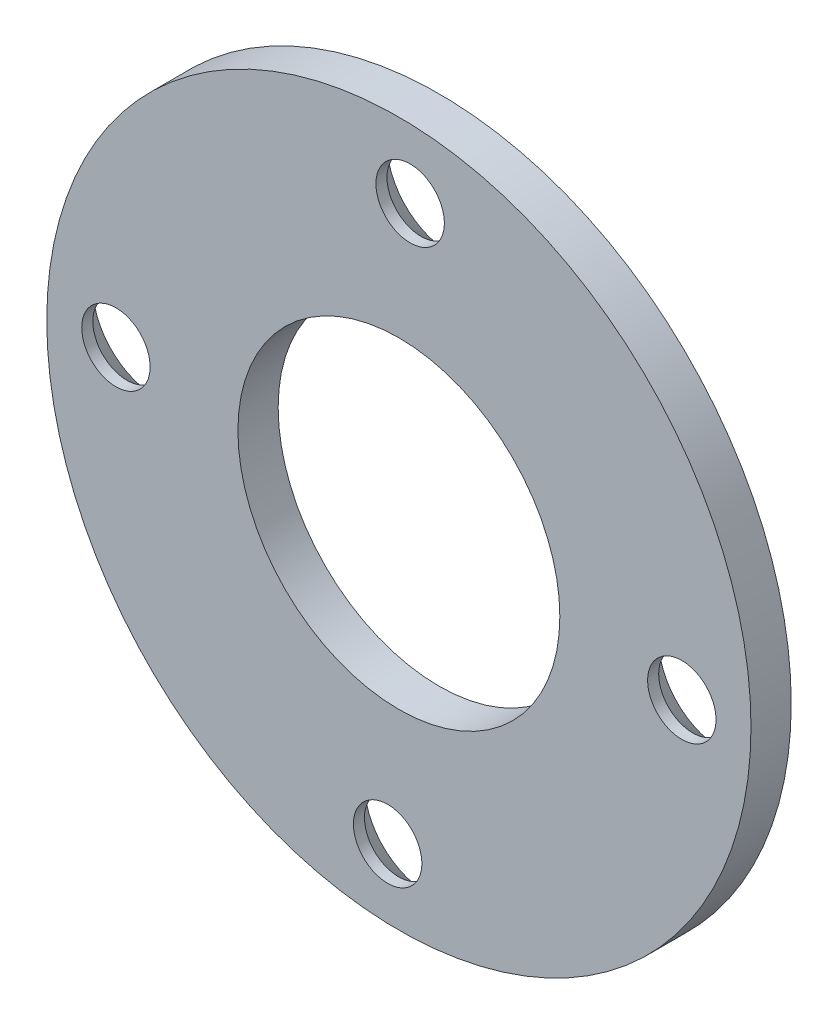
ISO-10303-21;
HEADER;
FILE_DESCRIPTION(('STEP AP214'),'2;1');
FILE_NAME('part.step','',(''),(''),'','','');
FILE_SCHEMA(('AUTOMOTIVE_DESIGN { 1 0 10303 214 1 1 1 1 }'));
ENDSEC;
DATA;
#1=APPLICATION_CONTEXT('core data for automotive mechanical design processes');
#2=APPLICATION_PROTOCOL_DEFINITION('international standard','automotive_design',2000,#1);
#3=PRODUCT_CONTEXT('',#1,'mechanical');
#4=PRODUCT('Part','Part','',(#3));
#5=PRODUCT_RELATED_PRODUCT_CATEGORY('part','',(#4));
#6=PRODUCT_DEFINITION_FORMATION('','',#4);
#7=PRODUCT_DEFINITION_CONTEXT('part definition',#1,'design');
#8=PRODUCT_DEFINITION('design','',#6,#7);
#9=PRODUCT_DEFINITION_SHAPE('','',#8);
#10=(LENGTH_UNIT() NAMED_UNIT(*) SI_UNIT(.MILLI.,.METRE.));
#11=(NAMED_UNIT(*) PLANE_ANGLE_UNIT() SI_UNIT($,.RADIAN.));
#12=(NAMED_UNIT(*) SI_UNIT($,.STERADIAN.) SOLID_ANGLE_UNIT());
#13=UNCERTAINTY_MEASURE_WITH_UNIT(LENGTH_MEASURE(1.E-05),#10,'distance_accuracy_value','');
#14=(GEOMETRIC_REPRESENTATION_CONTEXT(3) GLOBAL_UNCERTAINTY_ASSIGNED_CONTEXT((#13)) GLOBAL_UNIT_ASSIGNED_CONTEXT((#10,
#11,#12)) REPRESENTATION_CONTEXT('',''));
#15=CARTESIAN_POINT('',(0.,0.,0.));
#16=DIRECTION('',(0.,0.,1.));
#17=DIRECTION('',(1.,0.,0.));
#18=AXIS2_PLACEMENT_3D('',#15,#16,#17);
#19=CARTESIAN_POINT('',(0.,0.,2.));
#20=DIRECTION('',(0.,0.,1.));
#21=DIRECTION('',(1.,0.,0.));
#22=AXIS2_PLACEMENT_3D('',#19,#20,#21);
#23=PLANE('',#22);
#24=CARTESIAN_POINT('',(0.559155653984772,14.0619777082516,2.));
#25=DIRECTION('',(0.,0.,-1.));
#26=DIRECTION('',(-1.,0.,0.));
#27=AXIS2_PLACEMENT_3D('',#24,#25,#26);
#28=CIRCLE('',#27,1.7);
#29=CARTESIAN_POINT('',(-1.14084434601523,14.0619777082516,2.));
#30=VERTEX_POINT('',#29);
#31=EDGE_CURVE('E75',#30,#30,#28,.T.);
#32=ORIENTED_EDGE('',*,*,#31,.T.);
#33=EDGE_LOOP('',(#32));
#34=FACE_BOUND('',#33,.T.);
#35=CARTESIAN_POINT('',(-14.0619777082517,0.559155653984698,2.));
#36=DIRECTION('',(0.,0.,-1.));
#37=DIRECTION('',(-1.,0.,0.));
#38=AXIS2_PLACEMENT_3D('',#35,#36,#37);
#39=CIRCLE('',#38,1.7);
#40=CARTESIAN_POINT('',(-15.7619777082517,0.559155653984698,2.));
#41=VERTEX_POINT('',#40);
#42=EDGE_CURVE('E66',#41,#41,#39,.T.);
#43=ORIENTED_EDGE('',*,*,#42,.T.);
#44=EDGE_LOOP('',(#43));
#45=FACE_BOUND('',#44,.T.);
#46=CARTESIAN_POINT('',(-0.559155653984785,-14.0619777082517,2.));
#47=DIRECTION('',(0.,0.,-1.));
#48=DIRECTION('',(-1.,0.,0.));
#49=AXIS2_PLACEMENT_3D('',#46,#47,#48);
#50=CIRCLE('',#49,1.7);
#51=CARTESIAN_POINT('',(-2.25915565398479,-14.0619777082517,2.));
#52=VERTEX_POINT('',#51);
#53=EDGE_CURVE('E57',#52,#52,#50,.T.);
#54=ORIENTED_EDGE('',*,*,#53,.T.);
#55=EDGE_LOOP('',(#54));
#56=FACE_BOUND('',#55,.T.);
#57=CARTESIAN_POINT('',(14.0619777082517,-0.559155653984664,2.));
#58=DIRECTION('',(0.,0.,-1.));
#59=DIRECTION('',(-1.,0.,0.));
#60=AXIS2_PLACEMENT_3D('',#57,#58,#59);
#61=CIRCLE('',#60,1.7);
#62=CARTESIAN_POINT('',(12.3619777082517,-0.559155653984664,2.));
#63=VERTEX_POINT('',#62);
#64=EDGE_CURVE('E46',#63,#63,#61,.T.);
#65=ORIENTED_EDGE('',*,*,#64,.T.);
#66=EDGE_LOOP('',(#65));
#67=FACE_BOUND('',#66,.T.);
#68=CARTESIAN_POINT('',(0.,0.,2.));
#69=DIRECTION('',(0.,0.,1.));
#70=DIRECTION('',(1.,0.,0.));
#71=AXIS2_PLACEMENT_3D('',#68,#69,#70);
#72=CIRCLE('',#71,17.5);
#73=CARTESIAN_POINT('',(17.5,0.,2.));
#74=VERTEX_POINT('',#73);
#75=EDGE_CURVE('E10',#74,#74,#72,.T.);
#76=ORIENTED_EDGE('',*,*,#75,.T.);
#77=EDGE_LOOP('',(#76));
#78=FACE_BOUND('',#77,.T.);
#79=CARTESIAN_POINT('',(0.,0.,2.));
#80=DIRECTION('',(0.,0.,1.));
#81=DIRECTION('',(1.,0.,0.));
#82=AXIS2_PLACEMENT_3D('',#79,#80,#81);
#83=CIRCLE('',#82,8.);
#84=CARTESIAN_POINT('',(8.,0.,2.));
#85=VERTEX_POINT('',#84);
#86=EDGE_CURVE('E41',#85,#85,#83,.T.);
#87=ORIENTED_EDGE('',*,*,#86,.F.);
#88=EDGE_LOOP('',(#87));
#89=FACE_BOUND('',#88,.T.);
#90=ADVANCED_FACE('F30',(#34,#45,#56,#67,#78,#89),#23,.T.);
#91=CARTESIAN_POINT('',(0.,0.,0.));
#92=DIRECTION('',(0.,0.,1.));
#93=DIRECTION('',(1.,0.,0.));
#94=AXIS2_PLACEMENT_3D('',#91,#92,#93);
#95=PLANE('',#94);
#96=CARTESIAN_POINT('',(0.559155653984772,14.0619777082516,0.));
#97=DIRECTION('',(0.,0.,-1.));
#98=DIRECTION('',(-1.,0.,0.));
#99=AXIS2_PLACEMENT_3D('',#96,#97,#98);
#100=CIRCLE('',#99,3.15);
#101=CARTESIAN_POINT('',(-2.59084434601523,14.0619777082516,0.));
#102=VERTEX_POINT('',#101);
#103=EDGE_CURVE('E81',#102,#102,#100,.T.);
#104=ORIENTED_EDGE('',*,*,#103,.F.);
#105=EDGE_LOOP('',(#104));
#106=FACE_BOUND('',#105,.T.);
#107=CARTESIAN_POINT('',(-14.0619777082517,0.559155653984698,0.));
#108=DIRECTION('',(0.,0.,-1.));
#109=DIRECTION('',(-1.,0.,0.));
#110=AXIS2_PLACEMENT_3D('',#107,#108,#109);
#111=CIRCLE('',#110,3.15);
#112=CARTESIAN_POINT('',(-17.2119777082517,0.559155653984698,0.));
#113=VERTEX_POINT('',#112);
#114=EDGE_CURVE('E72',#113,#113,#111,.T.);
#115=ORIENTED_EDGE('',*,*,#114,.F.);
#116=EDGE_LOOP('',(#115));
#117=FACE_BOUND('',#116,.T.);
#118=CARTESIAN_POINT('',(-0.559155653984785,-14.0619777082517,0.));
#119=DIRECTION('',(0.,0.,-1.));
#120=DIRECTION('',(-1.,0.,0.));
#121=AXIS2_PLACEMENT_3D('',#118,#119,#120);
#122=CIRCLE('',#121,3.15);
#123=CARTESIAN_POINT('',(-3.70915565398478,-14.0619777082517,0.));
#124=VERTEX_POINT('',#123);
#125=EDGE_CURVE('E63',#124,#124,#122,.T.);
#126=ORIENTED_EDGE('',*,*,#125,.F.);
#127=EDGE_LOOP('',(#126));
#128=FACE_BOUND('',#127,.T.);
#129=CARTESIAN_POINT('',(14.0619777082517,-0.559155653984664,0.));
#130=DIRECTION('',(0.,0.,-1.));
#131=DIRECTION('',(-1.,0.,0.));
#132=AXIS2_PLACEMENT_3D('',#129,#130,#131);
#133=CIRCLE('',#132,3.15);
#134=CARTESIAN_POINT('',(10.9119777082517,-0.559155653984664,0.));
#135=VERTEX_POINT('',#134);
#136=EDGE_CURVE('E54',#135,#135,#133,.T.);
#137=ORIENTED_EDGE('',*,*,#136,.F.);
#138=EDGE_LOOP('',(#137));
#139=FACE_BOUND('',#138,.T.);
#140=CARTESIAN_POINT('',(0.,0.,0.));
#141=DIRECTION('',(0.,0.,1.));
#142=DIRECTION('',(1.,0.,0.));
#143=AXIS2_PLACEMENT_3D('',#140,#141,#142);
#144=CIRCLE('',#143,17.5);
#145=CARTESIAN_POINT('',(17.5,0.,0.));
#146=VERTEX_POINT('',#145);
#147=EDGE_CURVE('E34',#146,#146,#144,.T.);
#148=ORIENTED_EDGE('',*,*,#147,.F.);
#149=EDGE_LOOP('',(#148));
#150=FACE_BOUND('',#149,.T.);
#151=CARTESIAN_POINT('',(0.,0.,0.));
#152=DIRECTION('',(0.,0.,1.));
#153=DIRECTION('',(1.,0.,0.));
#154=AXIS2_PLACEMENT_3D('',#151,#152,#153);
#155=CIRCLE('',#154,8.);
#156=CARTESIAN_POINT('',(8.,0.,0.));
#157=VERTEX_POINT('',#156);
#158=EDGE_CURVE('E43',#157,#157,#155,.T.);
#159=ORIENTED_EDGE('',*,*,#158,.T.);
#160=EDGE_LOOP('',(#159));
#161=FACE_BOUND('',#160,.T.);
#162=ADVANCED_FACE('F87',(#106,#117,#128,#139,#150,#161),#95,.F.);
#163=CARTESIAN_POINT('',(0.,0.,2.));
#164=DIRECTION('',(0.,0.,-1.));
#165=DIRECTION('',(-1.,0.,0.));
#166=AXIS2_PLACEMENT_3D('',#163,#164,#165);
#167=CYLINDRICAL_SURFACE('',#166,17.5);
#168=ORIENTED_EDGE('',*,*,#75,.F.);
#169=EDGE_LOOP('',(#168));
#170=FACE_BOUND('',#169,.T.);
#171=ORIENTED_EDGE('',*,*,#147,.T.);
#172=EDGE_LOOP('',(#171));
#173=FACE_BOUND('',#172,.T.);
#174=ADVANCED_FACE('F32',(#170,#173),#167,.T.);
#175=CARTESIAN_POINT('',(0.,0.,2.));
#176=DIRECTION('',(0.,0.,-1.));
#177=DIRECTION('',(-1.,0.,0.));
#178=AXIS2_PLACEMENT_3D('',#175,#176,#177);
#179=CYLINDRICAL_SURFACE('',#178,8.);
#180=ORIENTED_EDGE('',*,*,#86,.T.);
#181=EDGE_LOOP('',(#180));
#182=FACE_BOUND('',#181,.T.);
#183=ORIENTED_EDGE('',*,*,#158,.F.);
#184=EDGE_LOOP('',(#183));
#185=FACE_BOUND('',#184,.T.);
#186=ADVANCED_FACE('F100',(#182,#185),#179,.F.);
#187=CARTESIAN_POINT('',(14.0619777082517,-0.559155653984664,0.));
#188=DIRECTION('',(0.,0.,-1.));
#189=DIRECTION('',(-1.,0.,0.));
#190=AXIS2_PLACEMENT_3D('',#187,#188,#189);
#191=CYLINDRICAL_SURFACE('',#190,1.7);
#192=ORIENTED_EDGE('',*,*,#64,.F.);
#193=EDGE_LOOP('',(#192));
#194=FACE_BOUND('',#193,.T.);
#195=CARTESIAN_POINT('',(14.0619777082517,-0.559155653984664,1.45));
#196=DIRECTION('',(0.,0.,-1.));
#197=DIRECTION('',(-1.,0.,0.));
#198=AXIS2_PLACEMENT_3D('',#195,#196,#197);
#199=CIRCLE('',#198,1.7);
#200=CARTESIAN_POINT('',(12.3619777082517,-0.559155653984664,1.45));
#201=VERTEX_POINT('',#200);
#202=EDGE_CURVE('E51',#201,#201,#199,.T.);
#203=ORIENTED_EDGE('',*,*,#202,.T.);
#204=EDGE_LOOP('',(#203));
#205=FACE_BOUND('',#204,.T.);
#206=ADVANCED_FACE('F102',(#194,#205),#191,.F.);
#207=CARTESIAN_POINT('',(14.0619777082517,-0.559155653984664,0.));
#208=DIRECTION('',(0.,0.,-1.));
#209=DIRECTION('',(-1.,0.,0.));
#210=AXIS2_PLACEMENT_3D('',#207,#208,#209);
#211=CONICAL_SURFACE('',#210,3.15,0.785398163397449);
#212=ORIENTED_EDGE('',*,*,#202,.F.);
#213=EDGE_LOOP('',(#212));
#214=FACE_BOUND('',#213,.T.);
#215=ORIENTED_EDGE('',*,*,#136,.T.);
#216=EDGE_LOOP('',(#215));
#217=FACE_BOUND('',#216,.T.);
#218=ADVANCED_FACE('F109',(#214,#217),#211,.F.);
#219=CARTESIAN_POINT('',(-0.559155653984785,-14.0619777082517,0.));
#220=DIRECTION('',(0.,0.,-1.));
#221=DIRECTION('',(-1.,0.,0.));
#222=AXIS2_PLACEMENT_3D('',#219,#220,#221);
#223=CYLINDRICAL_SURFACE('',#222,1.7);
#224=ORIENTED_EDGE('',*,*,#53,.F.);
#225=EDGE_LOOP('',(#224));
#226=FACE_BOUND('',#225,.T.);
#227=CARTESIAN_POINT('',(-0.559155653984785,-14.0619777082517,1.45));
#228=DIRECTION('',(0.,0.,-1.));
#229=DIRECTION('',(-1.,0.,0.));
#230=AXIS2_PLACEMENT_3D('',#227,#228,#229);
#231=CIRCLE('',#230,1.7);
#232=CARTESIAN_POINT('',(-2.25915565398479,-14.0619777082517,1.45));
#233=VERTEX_POINT('',#232);
#234=EDGE_CURVE('E60',#233,#233,#231,.T.);
#235=ORIENTED_EDGE('',*,*,#234,.T.);
#236=EDGE_LOOP('',(#235));
#237=FACE_BOUND('',#236,.T.);
#238=ADVANCED_FACE('F132',(#226,#237),#223,.F.);
#239=CARTESIAN_POINT('',(-0.559155653984785,-14.0619777082517,0.));
#240=DIRECTION('',(0.,0.,-1.));
#241=DIRECTION('',(-1.,0.,0.));
#242=AXIS2_PLACEMENT_3D('',#239,#240,#241);
#243=CONICAL_SURFACE('',#242,3.15,0.785398163397448);
#244=ORIENTED_EDGE('',*,*,#234,.F.);
#245=EDGE_LOOP('',(#244));
#246=FACE_BOUND('',#245,.T.);
#247=ORIENTED_EDGE('',*,*,#125,.T.);
#248=EDGE_LOOP('',(#247));
#249=FACE_BOUND('',#248,.T.);
#250=ADVANCED_FACE('F137',(#246,#249),#243,.F.);
#251=CARTESIAN_POINT('',(-14.0619777082517,0.559155653984698,0.));
#252=DIRECTION('',(0.,0.,-1.));
#253=DIRECTION('',(-1.,0.,0.));
#254=AXIS2_PLACEMENT_3D('',#251,#252,#253);
#255=CYLINDRICAL_SURFACE('',#254,1.7);
#256=ORIENTED_EDGE('',*,*,#42,.F.);
#257=EDGE_LOOP('',(#256));
#258=FACE_BOUND('',#257,.T.);
#259=CARTESIAN_POINT('',(-14.0619777082517,0.559155653984698,1.45));
#260=DIRECTION('',(0.,0.,-1.));
#261=DIRECTION('',(-1.,0.,0.));
#262=AXIS2_PLACEMENT_3D('',#259,#260,#261);
#263=CIRCLE('',#262,1.7);
#264=CARTESIAN_POINT('',(-15.7619777082517,0.559155653984698,1.45));
#265=VERTEX_POINT('',#264);
#266=EDGE_CURVE('E69',#265,#265,#263,.T.);
#267=ORIENTED_EDGE('',*,*,#266,.T.);
#268=EDGE_LOOP('',(#267));
#269=FACE_BOUND('',#268,.T.);
#270=ADVANCED_FACE('F143',(#258,#269),#255,.F.);
#271=CARTESIAN_POINT('',(-14.0619777082517,0.559155653984698,0.));
#272=DIRECTION('',(0.,0.,-1.));
#273=DIRECTION('',(-1.,0.,0.));
#274=AXIS2_PLACEMENT_3D('',#271,#272,#273);
#275=CONICAL_SURFACE('',#274,3.15,0.785398163397448);
#276=ORIENTED_EDGE('',*,*,#266,.F.);
#277=EDGE_LOOP('',(#276));
#278=FACE_BOUND('',#277,.T.);
#279=ORIENTED_EDGE('',*,*,#114,.T.);
#280=EDGE_LOOP('',(#279));
#281=FACE_BOUND('',#280,.T.);
#282=ADVANCED_FACE('F147',(#278,#281),#275,.F.);
#283=CARTESIAN_POINT('',(0.559155653984772,14.0619777082516,0.));
#284=DIRECTION('',(0.,0.,-1.));
#285=DIRECTION('',(-1.,0.,0.));
#286=AXIS2_PLACEMENT_3D('',#283,#284,#285);
#287=CYLINDRICAL_SURFACE('',#286,1.7);
#288=ORIENTED_EDGE('',*,*,#31,.F.);
#289=EDGE_LOOP('',(#288));
#290=FACE_BOUND('',#289,.T.);
#291=CARTESIAN_POINT('',(0.559155653984772,14.0619777082516,1.45));
#292=DIRECTION('',(0.,0.,-1.));
#293=DIRECTION('',(-1.,0.,0.));
#294=AXIS2_PLACEMENT_3D('',#291,#292,#293);
#295=CIRCLE('',#294,1.7);
#296=CARTESIAN_POINT('',(-1.14084434601523,14.0619777082516,1.45));
#297=VERTEX_POINT('',#296);
#298=EDGE_CURVE('E78',#297,#297,#295,.T.);
#299=ORIENTED_EDGE('',*,*,#298,.T.);
#300=EDGE_LOOP('',(#299));
#301=FACE_BOUND('',#300,.T.);
#302=ADVANCED_FACE('F151',(#290,#301),#287,.F.);
#303=CARTESIAN_POINT('',(0.559155653984772,14.0619777082516,0.));
#304=DIRECTION('',(0.,0.,-1.));
#305=DIRECTION('',(-1.,0.,0.));
#306=AXIS2_PLACEMENT_3D('',#303,#304,#305);
#307=CONICAL_SURFACE('',#306,3.15,0.785398163397448);
#308=ORIENTED_EDGE('',*,*,#298,.F.);
#309=EDGE_LOOP('',(#308));
#310=FACE_BOUND('',#309,.T.);
#311=ORIENTED_EDGE('',*,*,#103,.T.);
#312=EDGE_LOOP('',(#311));
#313=FACE_BOUND('',#312,.T.);
#314=ADVANCED_FACE('F85',(#310,#313),#307,.F.);
#315=CLOSED_SHELL('',(#90,#162,#174,#186,#206,#218,#238,#250,#270,#282,#302,#314));
#316=MANIFOLD_SOLID_BREP('B2',#315);
#317=ADVANCED_BREP_SHAPE_REPRESENTATION('',(#18,#316),#14);
#318=SHAPE_DEFINITION_REPRESENTATION(#9,#317);
ENDSEC;
END-ISO-10303-21;
